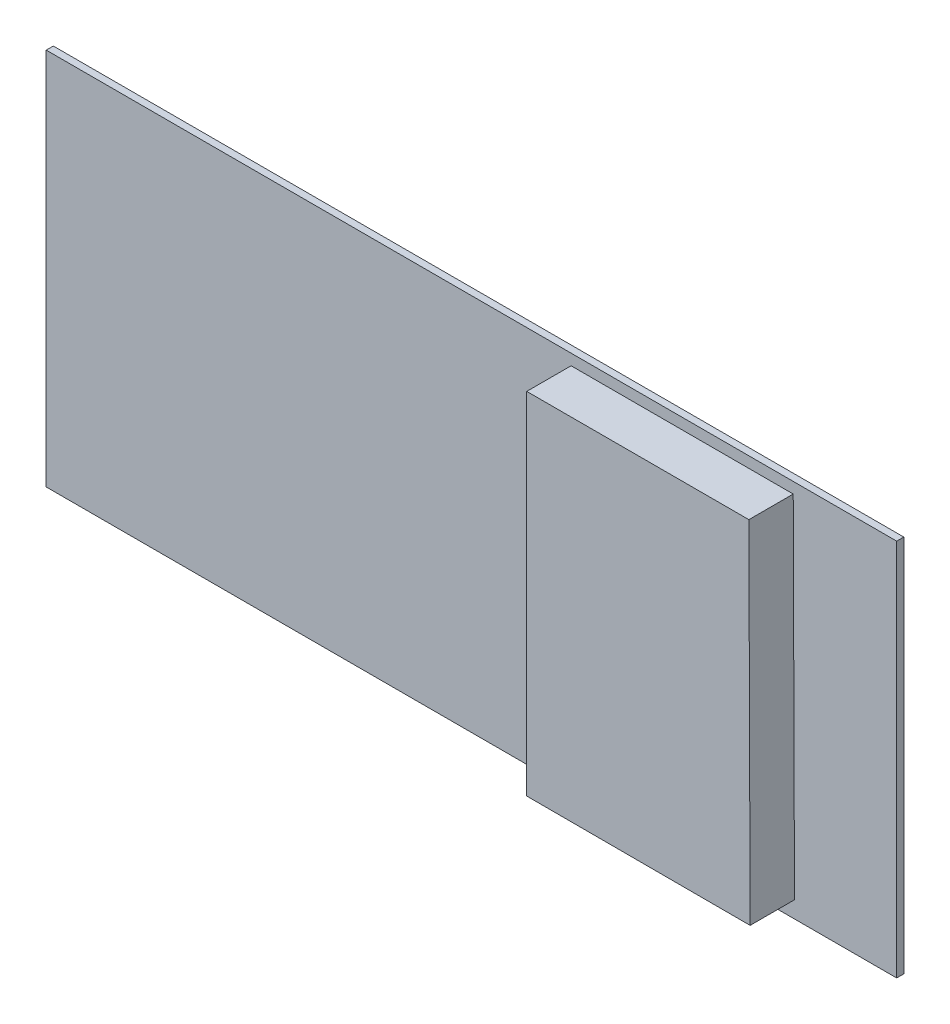
ISO-10303-21;
HEADER;
FILE_DESCRIPTION(('STEP AP214'),'2;1');
FILE_NAME('part.step','',(''),(''),'','','');
FILE_SCHEMA(('AUTOMOTIVE_DESIGN { 1 0 10303 214 1 1 1 1 }'));
ENDSEC;
DATA;
#1=APPLICATION_CONTEXT('core data for automotive mechanical design processes');
#2=APPLICATION_PROTOCOL_DEFINITION('international standard','automotive_design',2000,#1);
#3=PRODUCT_CONTEXT('',#1,'mechanical');
#4=PRODUCT('Part','Part','',(#3));
#5=PRODUCT_RELATED_PRODUCT_CATEGORY('part','',(#4));
#6=PRODUCT_DEFINITION_FORMATION('','',#4);
#7=PRODUCT_DEFINITION_CONTEXT('part definition',#1,'design');
#8=PRODUCT_DEFINITION('design','',#6,#7);
#9=PRODUCT_DEFINITION_SHAPE('','',#8);
#10=(LENGTH_UNIT() NAMED_UNIT(*) SI_UNIT(.MILLI.,.METRE.));
#11=(NAMED_UNIT(*) PLANE_ANGLE_UNIT() SI_UNIT($,.RADIAN.));
#12=(NAMED_UNIT(*) SI_UNIT($,.STERADIAN.) SOLID_ANGLE_UNIT());
#13=UNCERTAINTY_MEASURE_WITH_UNIT(LENGTH_MEASURE(1.E-05),#10,'distance_accuracy_value','');
#14=(GEOMETRIC_REPRESENTATION_CONTEXT(3) GLOBAL_UNCERTAINTY_ASSIGNED_CONTEXT((#13)) GLOBAL_UNIT_ASSIGNED_CONTEXT((#10,
#11,#12)) REPRESENTATION_CONTEXT('',''));
#15=CARTESIAN_POINT('',(0.,0.,0.));
#16=DIRECTION('',(0.,0.,1.));
#17=DIRECTION('',(1.,0.,0.));
#18=AXIS2_PLACEMENT_3D('',#15,#16,#17);
#19=CARTESIAN_POINT('',(0.,0.,1.12));
#20=DIRECTION('',(0.,0.,1.));
#21=DIRECTION('',(1.,0.,0.));
#22=AXIS2_PLACEMENT_3D('',#19,#20,#21);
#23=PLANE('',#22);
#24=DIRECTION('',(0.,-1.,0.));
#25=VECTOR('',#24,1.);
#26=CARTESIAN_POINT('',(212.69999878,0.,1.12));
#27=LINE('',#26,#25);
#28=CARTESIAN_POINT('',(212.69999878,146.0999999,1.12));
#29=VERTEX_POINT('',#28);
#30=CARTESIAN_POINT('',(212.69999878,86.39999992,1.12));
#31=VERTEX_POINT('',#30);
#32=EDGE_CURVE('E134',#29,#31,#27,.T.);
#33=ORIENTED_EDGE('',*,*,#32,.F.);
#34=DIRECTION('',(1.,0.,0.));
#35=VECTOR('',#34,1.);
#36=CARTESIAN_POINT('',(0.,146.0999999,1.12));
#37=LINE('',#36,#35);
#38=CARTESIAN_POINT('',(78.50000048,146.0999999,1.12));
#39=VERTEX_POINT('',#38);
#40=EDGE_CURVE('E136',#39,#29,#37,.T.);
#41=ORIENTED_EDGE('',*,*,#40,.F.);
#42=DIRECTION('',(0.,1.,0.));
#43=VECTOR('',#42,1.);
#44=CARTESIAN_POINT('',(78.50000048,0.,1.12));
#45=LINE('',#44,#43);
#46=CARTESIAN_POINT('',(78.50000048,86.39999992,1.12));
#47=VERTEX_POINT('',#46);
#48=EDGE_CURVE('E140',#47,#39,#45,.T.);
#49=ORIENTED_EDGE('',*,*,#48,.F.);
#50=DIRECTION('',(-1.,0.,0.));
#51=VECTOR('',#50,1.);
#52=CARTESIAN_POINT('',(0.,86.39999992,1.12));
#53=LINE('',#52,#51);
#54=EDGE_CURVE('E143',#31,#47,#53,.T.);
#55=ORIENTED_EDGE('',*,*,#54,.F.);
#56=EDGE_LOOP('',(#33,#41,#49,#55));
#57=FACE_BOUND('',#56,.T.);
#58=DIRECTION('',(0.999999092026138,-0.00134757074014094,0.));
#59=VECTOR('',#58,1.);
#60=CARTESIAN_POINT('',(161.3255092,89.07300956,1.12));
#61=LINE('',#60,#59);
#62=CARTESIAN_POINT('',(161.3255092,89.07300956,1.12));
#63=VERTEX_POINT('',#62);
#64=CARTESIAN_POINT('',(196.57449128,89.02550902,1.12));
#65=VERTEX_POINT('',#64);
#66=EDGE_CURVE('E263',#63,#65,#61,.T.);
#67=ORIENTED_EDGE('',*,*,#66,.F.);
#68=DIRECTION('',(0.,-1.,0.));
#69=VECTOR('',#68,1.);
#70=CARTESIAN_POINT('',(161.3255092,89.07300956,1.12));
#71=LINE('',#70,#69);
#72=CARTESIAN_POINT('',(161.3255092,144.37449154,1.12));
#73=VERTEX_POINT('',#72);
#74=EDGE_CURVE('E125',#73,#63,#71,.T.);
#75=ORIENTED_EDGE('',*,*,#74,.F.);
#76=DIRECTION('',(-1.,0.,0.));
#77=VECTOR('',#76,1.);
#78=CARTESIAN_POINT('',(161.3255092,144.37449154,1.12));
#79=LINE('',#78,#77);
#80=CARTESIAN_POINT('',(196.37449168,144.37449154,1.12));
#81=VERTEX_POINT('',#80);
#82=EDGE_CURVE('E121',#81,#73,#79,.T.);
#83=ORIENTED_EDGE('',*,*,#82,.F.);
#84=DIRECTION('',(-0.00361340507490685,0.999993471630572,0.));
#85=VECTOR('',#84,1.);
#86=CARTESIAN_POINT('',(196.37449168,144.37449154,1.12));
#87=LINE('',#86,#85);
#88=EDGE_CURVE('E260',#65,#81,#87,.T.);
#89=ORIENTED_EDGE('',*,*,#88,.F.);
#90=EDGE_LOOP('',(#67,#75,#83,#89));
#91=FACE_BOUND('',#90,.T.);
#92=ADVANCED_FACE('F33',(#57,#91),#23,.T.);
#93=CARTESIAN_POINT('',(212.69999878,0.,1.12));
#94=DIRECTION('',(1.,0.,0.));
#95=DIRECTION('',(0.,0.,-1.));
#96=AXIS2_PLACEMENT_3D('',#93,#94,#95);
#97=PLANE('',#96);
#98=DIRECTION('',(0.,-1.,0.));
#99=VECTOR('',#98,1.);
#100=CARTESIAN_POINT('',(212.69999878,0.,0.));
#101=LINE('',#100,#99);
#102=CARTESIAN_POINT('',(212.69999878,146.0999999,0.));
#103=VERTEX_POINT('',#102);
#104=CARTESIAN_POINT('',(212.69999878,86.39999992,0.));
#105=VERTEX_POINT('',#104);
#106=EDGE_CURVE('E127',#103,#105,#101,.T.);
#107=ORIENTED_EDGE('',*,*,#106,.F.);
#108=DIRECTION('',(0.,0.,-1.));
#109=VECTOR('',#108,1.);
#110=CARTESIAN_POINT('',(212.69999878,146.0999999,1.12));
#111=LINE('',#110,#109);
#112=EDGE_CURVE('E11',#29,#103,#111,.T.);
#113=ORIENTED_EDGE('',*,*,#112,.F.);
#114=ORIENTED_EDGE('',*,*,#32,.T.);
#115=DIRECTION('',(0.,0.,-1.));
#116=VECTOR('',#115,1.);
#117=CARTESIAN_POINT('',(212.69999878,86.39999992,1.12));
#118=LINE('',#117,#116);
#119=EDGE_CURVE('E57',#31,#105,#118,.T.);
#120=ORIENTED_EDGE('',*,*,#119,.T.);
#121=EDGE_LOOP('',(#107,#113,#114,#120));
#122=FACE_BOUND('',#121,.T.);
#123=ADVANCED_FACE('F35',(#122),#97,.T.);
#124=CARTESIAN_POINT('',(0.,146.0999999,1.12));
#125=DIRECTION('',(0.,1.,0.));
#126=DIRECTION('',(0.,0.,1.));
#127=AXIS2_PLACEMENT_3D('',#124,#125,#126);
#128=PLANE('',#127);
#129=DIRECTION('',(1.,0.,0.));
#130=VECTOR('',#129,1.);
#131=CARTESIAN_POINT('',(0.,146.0999999,0.));
#132=LINE('',#131,#130);
#133=CARTESIAN_POINT('',(78.50000048,146.0999999,0.));
#134=VERTEX_POINT('',#133);
#135=EDGE_CURVE('E129',#134,#103,#132,.T.);
#136=ORIENTED_EDGE('',*,*,#135,.F.);
#137=DIRECTION('',(0.,0.,-1.));
#138=VECTOR('',#137,1.);
#139=CARTESIAN_POINT('',(78.50000048,146.0999999,1.12));
#140=LINE('',#139,#138);
#141=EDGE_CURVE('E41',#39,#134,#140,.T.);
#142=ORIENTED_EDGE('',*,*,#141,.F.);
#143=ORIENTED_EDGE('',*,*,#40,.T.);
#144=ORIENTED_EDGE('',*,*,#112,.T.);
#145=EDGE_LOOP('',(#136,#142,#143,#144));
#146=FACE_BOUND('',#145,.T.);
#147=ADVANCED_FACE('F161',(#146),#128,.T.);
#148=CARTESIAN_POINT('',(78.50000048,0.,1.12));
#149=DIRECTION('',(-1.,0.,0.));
#150=DIRECTION('',(0.,0.,1.));
#151=AXIS2_PLACEMENT_3D('',#148,#149,#150);
#152=PLANE('',#151);
#153=DIRECTION('',(0.,1.,0.));
#154=VECTOR('',#153,1.);
#155=CARTESIAN_POINT('',(78.50000048,0.,0.));
#156=LINE('',#155,#154);
#157=CARTESIAN_POINT('',(78.50000048,86.39999992,0.));
#158=VERTEX_POINT('',#157);
#159=EDGE_CURVE('E147',#158,#134,#156,.T.);
#160=ORIENTED_EDGE('',*,*,#159,.F.);
#161=DIRECTION('',(0.,0.,-1.));
#162=VECTOR('',#161,1.);
#163=CARTESIAN_POINT('',(78.50000048,86.39999992,1.12));
#164=LINE('',#163,#162);
#165=EDGE_CURVE('E153',#47,#158,#164,.T.);
#166=ORIENTED_EDGE('',*,*,#165,.F.);
#167=ORIENTED_EDGE('',*,*,#48,.T.);
#168=ORIENTED_EDGE('',*,*,#141,.T.);
#169=EDGE_LOOP('',(#160,#166,#167,#168));
#170=FACE_BOUND('',#169,.T.);
#171=ADVANCED_FACE('F157',(#170),#152,.T.);
#172=CARTESIAN_POINT('',(0.,86.39999992,1.12));
#173=DIRECTION('',(0.,-1.,0.));
#174=DIRECTION('',(0.,0.,-1.));
#175=AXIS2_PLACEMENT_3D('',#172,#173,#174);
#176=PLANE('',#175);
#177=DIRECTION('',(-1.,0.,0.));
#178=VECTOR('',#177,1.);
#179=CARTESIAN_POINT('',(0.,86.39999992,0.));
#180=LINE('',#179,#178);
#181=EDGE_CURVE('E137',#105,#158,#180,.T.);
#182=ORIENTED_EDGE('',*,*,#181,.F.);
#183=ORIENTED_EDGE('',*,*,#119,.F.);
#184=ORIENTED_EDGE('',*,*,#54,.T.);
#185=ORIENTED_EDGE('',*,*,#165,.T.);
#186=EDGE_LOOP('',(#182,#183,#184,#185));
#187=FACE_BOUND('',#186,.T.);
#188=ADVANCED_FACE('F164',(#187),#176,.T.);
#189=CARTESIAN_POINT('',(0.,0.,0.));
#190=DIRECTION('',(0.,0.,1.));
#191=DIRECTION('',(1.,0.,0.));
#192=AXIS2_PLACEMENT_3D('',#189,#190,#191);
#193=PLANE('',#192);
#194=ORIENTED_EDGE('',*,*,#106,.T.);
#195=ORIENTED_EDGE('',*,*,#181,.T.);
#196=ORIENTED_EDGE('',*,*,#159,.T.);
#197=ORIENTED_EDGE('',*,*,#135,.T.);
#198=EDGE_LOOP('',(#194,#195,#196,#197));
#199=FACE_BOUND('',#198,.T.);
#200=ADVANCED_FACE('F163',(#199),#193,.F.);
#201=CARTESIAN_POINT('',(161.3255092,89.07300956,8.12));
#202=DIRECTION('',(1.,0.,0.));
#203=DIRECTION('',(0.,0.,-1.));
#204=AXIS2_PLACEMENT_3D('',#201,#202,#203);
#205=PLANE('',#204);
#206=ORIENTED_EDGE('',*,*,#74,.T.);
#207=DIRECTION('',(0.,0.,-1.));
#208=VECTOR('',#207,1.);
#209=CARTESIAN_POINT('',(161.3255092,89.07300956,8.12));
#210=LINE('',#209,#208);
#211=CARTESIAN_POINT('',(161.3255092,89.07300956,8.12));
#212=VERTEX_POINT('',#211);
#213=EDGE_CURVE('E106',#212,#63,#210,.T.);
#214=ORIENTED_EDGE('',*,*,#213,.F.);
#215=DIRECTION('',(0.,-1.,0.));
#216=VECTOR('',#215,1.);
#217=CARTESIAN_POINT('',(161.3255092,89.07300956,8.12));
#218=LINE('',#217,#216);
#219=CARTESIAN_POINT('',(161.3255092,144.37449154,8.12));
#220=VERTEX_POINT('',#219);
#221=EDGE_CURVE('E113',#220,#212,#218,.T.);
#222=ORIENTED_EDGE('',*,*,#221,.F.);
#223=DIRECTION('',(0.,0.,-1.));
#224=VECTOR('',#223,1.);
#225=CARTESIAN_POINT('',(161.3255092,144.37449154,8.12));
#226=LINE('',#225,#224);
#227=EDGE_CURVE('E258',#220,#73,#226,.T.);
#228=ORIENTED_EDGE('',*,*,#227,.T.);
#229=EDGE_LOOP('',(#206,#214,#222,#228));
#230=FACE_BOUND('',#229,.T.);
#231=ADVANCED_FACE('F123',(#230),#205,.F.);
#232=CARTESIAN_POINT('',(161.3255092,89.07300956,8.12));
#233=DIRECTION('',(0.00134757074014094,0.999999092026138,0.));
#234=DIRECTION('',(-0.999999092026138,0.00134757074014094,0.));
#235=AXIS2_PLACEMENT_3D('',#232,#233,#234);
#236=PLANE('',#235);
#237=ORIENTED_EDGE('',*,*,#66,.T.);
#238=DIRECTION('',(0.,0.,-1.));
#239=VECTOR('',#238,1.);
#240=CARTESIAN_POINT('',(196.57449128,89.02550902,8.12));
#241=LINE('',#240,#239);
#242=CARTESIAN_POINT('',(196.57449128,89.02550902,8.12));
#243=VERTEX_POINT('',#242);
#244=EDGE_CURVE('E109',#243,#65,#241,.T.);
#245=ORIENTED_EDGE('',*,*,#244,.F.);
#246=DIRECTION('',(0.999999092026138,-0.00134757074014094,0.));
#247=VECTOR('',#246,1.);
#248=CARTESIAN_POINT('',(161.3255092,89.07300956,8.12));
#249=LINE('',#248,#247);
#250=EDGE_CURVE('E102',#212,#243,#249,.T.);
#251=ORIENTED_EDGE('',*,*,#250,.F.);
#252=ORIENTED_EDGE('',*,*,#213,.T.);
#253=EDGE_LOOP('',(#237,#245,#251,#252));
#254=FACE_BOUND('',#253,.T.);
#255=ADVANCED_FACE('F104',(#254),#236,.F.);
#256=CARTESIAN_POINT('',(196.37449168,144.37449154,8.12));
#257=DIRECTION('',(-0.999993471630572,-0.00361340507490685,0.));
#258=DIRECTION('',(0.00361340507490685,-0.999993471630573,0.));
#259=AXIS2_PLACEMENT_3D('',#256,#257,#258);
#260=PLANE('',#259);
#261=ORIENTED_EDGE('',*,*,#88,.T.);
#262=DIRECTION('',(0.,0.,-1.));
#263=VECTOR('',#262,1.);
#264=CARTESIAN_POINT('',(196.37449168,144.37449154,8.12));
#265=LINE('',#264,#263);
#266=CARTESIAN_POINT('',(196.37449168,144.37449154,8.12));
#267=VERTEX_POINT('',#266);
#268=EDGE_CURVE('E48',#267,#81,#265,.T.);
#269=ORIENTED_EDGE('',*,*,#268,.F.);
#270=DIRECTION('',(-0.00361340507490685,0.999993471630572,0.));
#271=VECTOR('',#270,1.);
#272=CARTESIAN_POINT('',(196.37449168,144.37449154,8.12));
#273=LINE('',#272,#271);
#274=EDGE_CURVE('E112',#243,#267,#273,.T.);
#275=ORIENTED_EDGE('',*,*,#274,.F.);
#276=ORIENTED_EDGE('',*,*,#244,.T.);
#277=EDGE_LOOP('',(#261,#269,#275,#276));
#278=FACE_BOUND('',#277,.T.);
#279=ADVANCED_FACE('F207',(#278),#260,.F.);
#280=CARTESIAN_POINT('',(161.3255092,144.37449154,8.12));
#281=DIRECTION('',(0.,-1.,0.));
#282=DIRECTION('',(0.,0.,-1.));
#283=AXIS2_PLACEMENT_3D('',#280,#281,#282);
#284=PLANE('',#283);
#285=ORIENTED_EDGE('',*,*,#82,.T.);
#286=ORIENTED_EDGE('',*,*,#227,.F.);
#287=DIRECTION('',(-1.,0.,0.));
#288=VECTOR('',#287,1.);
#289=CARTESIAN_POINT('',(161.3255092,144.37449154,8.12));
#290=LINE('',#289,#288);
#291=EDGE_CURVE('E117',#267,#220,#290,.T.);
#292=ORIENTED_EDGE('',*,*,#291,.F.);
#293=ORIENTED_EDGE('',*,*,#268,.T.);
#294=EDGE_LOOP('',(#285,#286,#292,#293));
#295=FACE_BOUND('',#294,.T.);
#296=ADVANCED_FACE('F213',(#295),#284,.F.);
#297=CARTESIAN_POINT('',(0.,0.,8.12));
#298=DIRECTION('',(0.,0.,-1.));
#299=DIRECTION('',(-1.,0.,0.));
#300=AXIS2_PLACEMENT_3D('',#297,#298,#299);
#301=PLANE('',#300);
#302=ORIENTED_EDGE('',*,*,#221,.T.);
#303=ORIENTED_EDGE('',*,*,#250,.T.);
#304=ORIENTED_EDGE('',*,*,#274,.T.);
#305=ORIENTED_EDGE('',*,*,#291,.T.);
#306=EDGE_LOOP('',(#302,#303,#304,#305));
#307=FACE_BOUND('',#306,.T.);
#308=ADVANCED_FACE('F116',(#307),#301,.F.);
#309=CLOSED_SHELL('',(#92,#123,#147,#171,#188,#200,#231,#255,#279,#296,#308));
#310=MANIFOLD_SOLID_BREP('B2',#309);
#311=ADVANCED_BREP_SHAPE_REPRESENTATION('',(#18,#310),#14);
#312=SHAPE_DEFINITION_REPRESENTATION(#9,#311);
ENDSEC;
END-ISO-10303-21;
